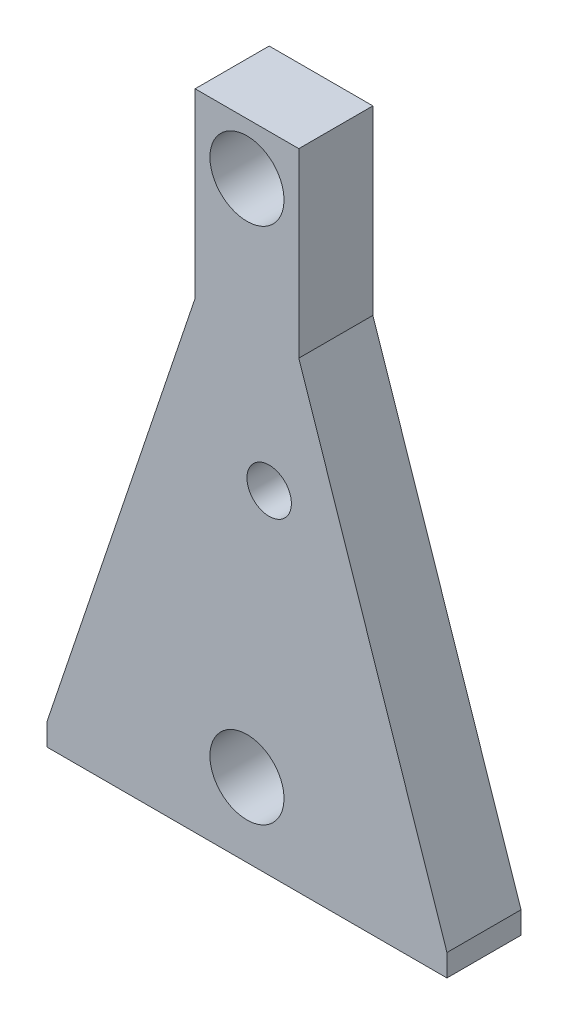
ISO-10303-21;
HEADER;
FILE_DESCRIPTION(('STEP AP214'),'2;1');
FILE_NAME('part.step','',(''),(''),'','','');
FILE_SCHEMA(('AUTOMOTIVE_DESIGN { 1 0 10303 214 1 1 1 1 }'));
ENDSEC;
DATA;
#1=APPLICATION_CONTEXT('core data for automotive mechanical design processes');
#2=APPLICATION_PROTOCOL_DEFINITION('international standard','automotive_design',2000,#1);
#3=PRODUCT_CONTEXT('',#1,'mechanical');
#4=PRODUCT('Part','Part','',(#3));
#5=PRODUCT_RELATED_PRODUCT_CATEGORY('part','',(#4));
#6=PRODUCT_DEFINITION_FORMATION('','',#4);
#7=PRODUCT_DEFINITION_CONTEXT('part definition',#1,'design');
#8=PRODUCT_DEFINITION('design','',#6,#7);
#9=PRODUCT_DEFINITION_SHAPE('','',#8);
#10=(LENGTH_UNIT() NAMED_UNIT(*) SI_UNIT(.MILLI.,.METRE.));
#11=(NAMED_UNIT(*) PLANE_ANGLE_UNIT() SI_UNIT($,.RADIAN.));
#12=(NAMED_UNIT(*) SI_UNIT($,.STERADIAN.) SOLID_ANGLE_UNIT());
#13=UNCERTAINTY_MEASURE_WITH_UNIT(LENGTH_MEASURE(1.E-05),#10,'distance_accuracy_value','');
#14=(GEOMETRIC_REPRESENTATION_CONTEXT(3) GLOBAL_UNCERTAINTY_ASSIGNED_CONTEXT((#13)) GLOBAL_UNIT_ASSIGNED_CONTEXT((#10,
#11,#12)) REPRESENTATION_CONTEXT('',''));
#15=CARTESIAN_POINT('',(0.,0.,0.));
#16=DIRECTION('',(0.,0.,1.));
#17=DIRECTION('',(1.,0.,0.));
#18=AXIS2_PLACEMENT_3D('',#15,#16,#17);
#19=CARTESIAN_POINT('',(0.,0.,5.));
#20=DIRECTION('',(1.,0.,0.));
#21=DIRECTION('',(0.,0.,-1.));
#22=AXIS2_PLACEMENT_3D('',#19,#20,#21);
#23=PLANE('',#22);
#24=DIRECTION('',(0.,0.,-1.));
#25=VECTOR('',#24,1.);
#26=CARTESIAN_POINT('',(0.,29.75,5.));
#27=LINE('',#26,#25);
#28=CARTESIAN_POINT('',(0.,29.75,5.));
#29=VERTEX_POINT('',#28);
#30=CARTESIAN_POINT('',(0.,29.75,0.));
#31=VERTEX_POINT('',#30);
#32=EDGE_CURVE('E50',#29,#31,#27,.T.);
#33=ORIENTED_EDGE('',*,*,#32,.F.);
#34=DIRECTION('',(0.,-1.,0.));
#35=VECTOR('',#34,1.);
#36=CARTESIAN_POINT('',(0.,0.,5.));
#37=LINE('',#36,#35);
#38=CARTESIAN_POINT('',(0.,42.,5.));
#39=VERTEX_POINT('',#38);
#40=EDGE_CURVE('E183',#39,#29,#37,.T.);
#41=ORIENTED_EDGE('',*,*,#40,.F.);
#42=DIRECTION('',(0.,0.,-1.));
#43=VECTOR('',#42,1.);
#44=CARTESIAN_POINT('',(0.,42.,5.));
#45=LINE('',#44,#43);
#46=CARTESIAN_POINT('',(0.,42.,0.));
#47=VERTEX_POINT('',#46);
#48=EDGE_CURVE('E43',#39,#47,#45,.T.);
#49=ORIENTED_EDGE('',*,*,#48,.T.);
#50=DIRECTION('',(0.,-1.,0.));
#51=VECTOR('',#50,1.);
#52=CARTESIAN_POINT('',(0.,0.,0.));
#53=LINE('',#52,#51);
#54=EDGE_CURVE('E174',#47,#31,#53,.T.);
#55=ORIENTED_EDGE('',*,*,#54,.T.);
#56=EDGE_LOOP('',(#33,#41,#49,#55));
#57=FACE_BOUND('',#56,.T.);
#58=ADVANCED_FACE('F36',(#57),#23,.F.);
#59=CARTESIAN_POINT('',(7.,0.,5.));
#60=DIRECTION('',(-1.,0.,0.));
#61=DIRECTION('',(0.,0.,1.));
#62=AXIS2_PLACEMENT_3D('',#59,#60,#61);
#63=PLANE('',#62);
#64=DIRECTION('',(0.,1.,0.));
#65=VECTOR('',#64,1.);
#66=CARTESIAN_POINT('',(7.,0.,5.));
#67=LINE('',#66,#65);
#68=CARTESIAN_POINT('',(7.,29.75,5.));
#69=VERTEX_POINT('',#68);
#70=CARTESIAN_POINT('',(7.,42.,5.));
#71=VERTEX_POINT('',#70);
#72=EDGE_CURVE('E185',#69,#71,#67,.T.);
#73=ORIENTED_EDGE('',*,*,#72,.F.);
#74=DIRECTION('',(0.,0.,-1.));
#75=VECTOR('',#74,1.);
#76=CARTESIAN_POINT('',(7.,29.75,5.));
#77=LINE('',#76,#75);
#78=CARTESIAN_POINT('',(7.,29.75,0.));
#79=VERTEX_POINT('',#78);
#80=EDGE_CURVE('E159',#69,#79,#77,.T.);
#81=ORIENTED_EDGE('',*,*,#80,.T.);
#82=DIRECTION('',(0.,1.,0.));
#83=VECTOR('',#82,1.);
#84=CARTESIAN_POINT('',(7.,0.,0.));
#85=LINE('',#84,#83);
#86=CARTESIAN_POINT('',(7.,42.,0.));
#87=VERTEX_POINT('',#86);
#88=EDGE_CURVE('E191',#79,#87,#85,.T.);
#89=ORIENTED_EDGE('',*,*,#88,.T.);
#90=DIRECTION('',(0.,0.,-1.));
#91=VECTOR('',#90,1.);
#92=CARTESIAN_POINT('',(7.,42.,5.));
#93=LINE('',#92,#91);
#94=EDGE_CURVE('E11',#71,#87,#93,.T.);
#95=ORIENTED_EDGE('',*,*,#94,.F.);
#96=EDGE_LOOP('',(#73,#81,#89,#95));
#97=FACE_BOUND('',#96,.T.);
#98=ADVANCED_FACE('F218',(#97),#63,.F.);
#99=CARTESIAN_POINT('',(0.,42.,5.));
#100=DIRECTION('',(0.,-1.,0.));
#101=DIRECTION('',(0.,0.,-1.));
#102=AXIS2_PLACEMENT_3D('',#99,#100,#101);
#103=PLANE('',#102);
#104=DIRECTION('',(-1.,0.,0.));
#105=VECTOR('',#104,1.);
#106=CARTESIAN_POINT('',(0.,42.,0.));
#107=LINE('',#106,#105);
#108=EDGE_CURVE('E186',#87,#47,#107,.T.);
#109=ORIENTED_EDGE('',*,*,#108,.T.);
#110=ORIENTED_EDGE('',*,*,#48,.F.);
#111=DIRECTION('',(-1.,0.,0.));
#112=VECTOR('',#111,1.);
#113=CARTESIAN_POINT('',(0.,42.,5.));
#114=LINE('',#113,#112);
#115=EDGE_CURVE('E188',#71,#39,#114,.T.);
#116=ORIENTED_EDGE('',*,*,#115,.F.);
#117=ORIENTED_EDGE('',*,*,#94,.T.);
#118=EDGE_LOOP('',(#109,#110,#116,#117));
#119=FACE_BOUND('',#118,.T.);
#120=ADVANCED_FACE('F216',(#119),#103,.F.);
#121=CARTESIAN_POINT('',(0.,0.,5.));
#122=DIRECTION('',(0.,0.,-1.));
#123=DIRECTION('',(-1.,0.,0.));
#124=AXIS2_PLACEMENT_3D('',#121,#122,#123);
#125=PLANE('',#124);
#126=CARTESIAN_POINT('',(5.,21.,5.));
#127=DIRECTION('',(0.,0.,-1.));
#128=DIRECTION('',(-1.,0.,0.));
#129=AXIS2_PLACEMENT_3D('',#126,#127,#128);
#130=CIRCLE('',#129,1.5);
#131=CARTESIAN_POINT('',(3.5,21.,5.));
#132=VERTEX_POINT('',#131);
#133=EDGE_CURVE('E167',#132,#132,#130,.T.);
#134=ORIENTED_EDGE('',*,*,#133,.T.);
#135=EDGE_LOOP('',(#134));
#136=FACE_BOUND('',#135,.T.);
#137=CARTESIAN_POINT('',(3.50000000000001,38.5,5.));
#138=DIRECTION('',(0.,0.,-1.));
#139=DIRECTION('',(-1.,0.,0.));
#140=AXIS2_PLACEMENT_3D('',#137,#138,#139);
#141=CIRCLE('',#140,2.5);
#142=CARTESIAN_POINT('',(1.00000000000001,38.5,5.));
#143=VERTEX_POINT('',#142);
#144=EDGE_CURVE('E171',#143,#143,#141,.T.);
#145=ORIENTED_EDGE('',*,*,#144,.T.);
#146=EDGE_LOOP('',(#145));
#147=FACE_BOUND('',#146,.T.);
#148=CARTESIAN_POINT('',(3.5,3.5,5.));
#149=DIRECTION('',(0.,0.,-1.));
#150=DIRECTION('',(-1.,0.,0.));
#151=AXIS2_PLACEMENT_3D('',#148,#149,#150);
#152=CIRCLE('',#151,2.5);
#153=CARTESIAN_POINT('',(1.,3.5,5.));
#154=VERTEX_POINT('',#153);
#155=EDGE_CURVE('E178',#154,#154,#152,.T.);
#156=ORIENTED_EDGE('',*,*,#155,.T.);
#157=EDGE_LOOP('',(#156));
#158=FACE_BOUND('',#157,.T.);
#159=ORIENTED_EDGE('',*,*,#40,.T.);
#160=DIRECTION('',(0.318616385711056,0.947883747490389,0.));
#161=VECTOR('',#160,1.);
#162=CARTESIAN_POINT('',(0.,29.75,5.));
#163=LINE('',#162,#161);
#164=CARTESIAN_POINT('',(-10.,0.,5.));
#165=VERTEX_POINT('',#164);
#166=EDGE_CURVE('E148',#165,#29,#163,.T.);
#167=ORIENTED_EDGE('',*,*,#166,.F.);
#168=DIRECTION('',(0.,1.,0.));
#169=VECTOR('',#168,1.);
#170=CARTESIAN_POINT('',(-10.,-1.49,5.));
#171=LINE('',#170,#169);
#172=CARTESIAN_POINT('',(-10.,-1.49,5.));
#173=VERTEX_POINT('',#172);
#174=EDGE_CURVE('E141',#173,#165,#171,.T.);
#175=ORIENTED_EDGE('',*,*,#174,.F.);
#176=DIRECTION('',(-1.,0.,0.));
#177=VECTOR('',#176,1.);
#178=CARTESIAN_POINT('',(17.,-1.49,5.));
#179=LINE('',#178,#177);
#180=CARTESIAN_POINT('',(17.,-1.49,5.));
#181=VERTEX_POINT('',#180);
#182=EDGE_CURVE('E129',#181,#173,#179,.T.);
#183=ORIENTED_EDGE('',*,*,#182,.F.);
#184=DIRECTION('',(0.,1.,0.));
#185=VECTOR('',#184,1.);
#186=CARTESIAN_POINT('',(17.,-1.49,5.));
#187=LINE('',#186,#185);
#188=CARTESIAN_POINT('',(17.,0.,5.));
#189=VERTEX_POINT('',#188);
#190=EDGE_CURVE('E144',#181,#189,#187,.T.);
#191=ORIENTED_EDGE('',*,*,#190,.T.);
#192=DIRECTION('',(0.318616385711055,-0.947883747490389,0.));
#193=VECTOR('',#192,1.);
#194=CARTESIAN_POINT('',(7.,29.75,5.));
#195=LINE('',#194,#193);
#196=EDGE_CURVE('E157',#69,#189,#195,.T.);
#197=ORIENTED_EDGE('',*,*,#196,.F.);
#198=ORIENTED_EDGE('',*,*,#72,.T.);
#199=ORIENTED_EDGE('',*,*,#115,.T.);
#200=EDGE_LOOP('',(#159,#167,#175,#183,#191,#197,#198,#199));
#201=FACE_BOUND('',#200,.T.);
#202=ADVANCED_FACE('F212',(#136,#147,#158,#201),#125,.F.);
#203=CARTESIAN_POINT('',(0.,0.,0.));
#204=DIRECTION('',(0.,0.,-1.));
#205=DIRECTION('',(-1.,0.,0.));
#206=AXIS2_PLACEMENT_3D('',#203,#204,#205);
#207=PLANE('',#206);
#208=CARTESIAN_POINT('',(5.,21.,0.));
#209=DIRECTION('',(0.,0.,-1.));
#210=DIRECTION('',(-1.,0.,0.));
#211=AXIS2_PLACEMENT_3D('',#208,#209,#210);
#212=CIRCLE('',#211,1.5);
#213=CARTESIAN_POINT('',(3.5,21.,0.));
#214=VERTEX_POINT('',#213);
#215=EDGE_CURVE('E163',#214,#214,#212,.T.);
#216=ORIENTED_EDGE('',*,*,#215,.F.);
#217=EDGE_LOOP('',(#216));
#218=FACE_BOUND('',#217,.T.);
#219=CARTESIAN_POINT('',(3.50000000000001,38.5,0.));
#220=DIRECTION('',(0.,0.,-1.));
#221=DIRECTION('',(-1.,0.,0.));
#222=AXIS2_PLACEMENT_3D('',#219,#220,#221);
#223=CIRCLE('',#222,2.5);
#224=CARTESIAN_POINT('',(1.00000000000001,38.5,0.));
#225=VERTEX_POINT('',#224);
#226=EDGE_CURVE('E175',#225,#225,#223,.T.);
#227=ORIENTED_EDGE('',*,*,#226,.F.);
#228=EDGE_LOOP('',(#227));
#229=FACE_BOUND('',#228,.T.);
#230=CARTESIAN_POINT('',(3.5,3.5,0.));
#231=DIRECTION('',(0.,0.,-1.));
#232=DIRECTION('',(-1.,0.,0.));
#233=AXIS2_PLACEMENT_3D('',#230,#231,#232);
#234=CIRCLE('',#233,2.5);
#235=CARTESIAN_POINT('',(1.,3.5,0.));
#236=VERTEX_POINT('',#235);
#237=EDGE_CURVE('E170',#236,#236,#234,.T.);
#238=ORIENTED_EDGE('',*,*,#237,.F.);
#239=EDGE_LOOP('',(#238));
#240=FACE_BOUND('',#239,.T.);
#241=ORIENTED_EDGE('',*,*,#54,.F.);
#242=ORIENTED_EDGE('',*,*,#108,.F.);
#243=ORIENTED_EDGE('',*,*,#88,.F.);
#244=DIRECTION('',(0.318616385711055,-0.947883747490389,0.));
#245=VECTOR('',#244,1.);
#246=CARTESIAN_POINT('',(7.,29.75,0.));
#247=LINE('',#246,#245);
#248=CARTESIAN_POINT('',(17.,0.,0.));
#249=VERTEX_POINT('',#248);
#250=EDGE_CURVE('E58',#79,#249,#247,.T.);
#251=ORIENTED_EDGE('',*,*,#250,.T.);
#252=DIRECTION('',(0.,1.,0.));
#253=VECTOR('',#252,1.);
#254=CARTESIAN_POINT('',(17.,-1.49,0.));
#255=LINE('',#254,#253);
#256=CARTESIAN_POINT('',(17.,-1.49,0.));
#257=VERTEX_POINT('',#256);
#258=EDGE_CURVE('E135',#257,#249,#255,.T.);
#259=ORIENTED_EDGE('',*,*,#258,.F.);
#260=DIRECTION('',(1.,0.,0.));
#261=VECTOR('',#260,1.);
#262=CARTESIAN_POINT('',(17.,-1.49,0.));
#263=LINE('',#262,#261);
#264=CARTESIAN_POINT('',(-10.,-1.49,0.));
#265=VERTEX_POINT('',#264);
#266=EDGE_CURVE('E133',#265,#257,#263,.T.);
#267=ORIENTED_EDGE('',*,*,#266,.F.);
#268=DIRECTION('',(0.,1.,0.));
#269=VECTOR('',#268,1.);
#270=CARTESIAN_POINT('',(-10.,-1.49,0.));
#271=LINE('',#270,#269);
#272=CARTESIAN_POINT('',(-10.,0.,0.));
#273=VERTEX_POINT('',#272);
#274=EDGE_CURVE('E138',#265,#273,#271,.T.);
#275=ORIENTED_EDGE('',*,*,#274,.T.);
#276=DIRECTION('',(0.318616385711056,0.947883747490389,0.));
#277=VECTOR('',#276,1.);
#278=CARTESIAN_POINT('',(0.,29.75,0.));
#279=LINE('',#278,#277);
#280=EDGE_CURVE('E147',#273,#31,#279,.T.);
#281=ORIENTED_EDGE('',*,*,#280,.T.);
#282=EDGE_LOOP('',(#241,#242,#243,#251,#259,#267,#275,#281));
#283=FACE_BOUND('',#282,.T.);
#284=ADVANCED_FACE('F200',(#218,#229,#240,#283),#207,.T.);
#285=CARTESIAN_POINT('',(3.5,3.5,5.));
#286=DIRECTION('',(0.,0.,-1.));
#287=DIRECTION('',(-1.,0.,0.));
#288=AXIS2_PLACEMENT_3D('',#285,#286,#287);
#289=CYLINDRICAL_SURFACE('',#288,2.5);
#290=ORIENTED_EDGE('',*,*,#155,.F.);
#291=EDGE_LOOP('',(#290));
#292=FACE_BOUND('',#291,.T.);
#293=ORIENTED_EDGE('',*,*,#237,.T.);
#294=EDGE_LOOP('',(#293));
#295=FACE_BOUND('',#294,.T.);
#296=ADVANCED_FACE('F251',(#292,#295),#289,.F.);
#297=CARTESIAN_POINT('',(3.50000000000001,38.5,5.));
#298=DIRECTION('',(0.,0.,-1.));
#299=DIRECTION('',(-1.,0.,0.));
#300=AXIS2_PLACEMENT_3D('',#297,#298,#299);
#301=CYLINDRICAL_SURFACE('',#300,2.5);
#302=ORIENTED_EDGE('',*,*,#144,.F.);
#303=EDGE_LOOP('',(#302));
#304=FACE_BOUND('',#303,.T.);
#305=ORIENTED_EDGE('',*,*,#226,.T.);
#306=EDGE_LOOP('',(#305));
#307=FACE_BOUND('',#306,.T.);
#308=ADVANCED_FACE('F258',(#304,#307),#301,.F.);
#309=CARTESIAN_POINT('',(5.,21.,10.));
#310=DIRECTION('',(0.,0.,-1.));
#311=DIRECTION('',(-1.,0.,0.));
#312=AXIS2_PLACEMENT_3D('',#309,#310,#311);
#313=CYLINDRICAL_SURFACE('',#312,1.5);
#314=ORIENTED_EDGE('',*,*,#215,.T.);
#315=EDGE_LOOP('',(#314));
#316=FACE_BOUND('',#315,.T.);
#317=ORIENTED_EDGE('',*,*,#133,.F.);
#318=EDGE_LOOP('',(#317));
#319=FACE_BOUND('',#318,.T.);
#320=ADVANCED_FACE('F262',(#316,#319),#313,.F.);
#321=CARTESIAN_POINT('',(7.,29.75,5.));
#322=DIRECTION('',(0.947883747490389,0.318616385711055,0.));
#323=DIRECTION('',(-0.318616385711055,0.947883747490389,0.));
#324=AXIS2_PLACEMENT_3D('',#321,#322,#323);
#325=PLANE('',#324);
#326=ORIENTED_EDGE('',*,*,#250,.F.);
#327=ORIENTED_EDGE('',*,*,#80,.F.);
#328=ORIENTED_EDGE('',*,*,#196,.T.);
#329=DIRECTION('',(0.,0.,-1.));
#330=VECTOR('',#329,1.);
#331=CARTESIAN_POINT('',(17.,0.,5.));
#332=LINE('',#331,#330);
#333=EDGE_CURVE('E161',#189,#249,#332,.T.);
#334=ORIENTED_EDGE('',*,*,#333,.T.);
#335=EDGE_LOOP('',(#326,#327,#328,#334));
#336=FACE_BOUND('',#335,.T.);
#337=ADVANCED_FACE('F266',(#336),#325,.T.);
#338=CARTESIAN_POINT('',(0.,29.75,5.));
#339=DIRECTION('',(-0.947883747490389,0.318616385711056,0.));
#340=DIRECTION('',(-0.318616385711056,-0.947883747490389,0.));
#341=AXIS2_PLACEMENT_3D('',#338,#339,#340);
#342=PLANE('',#341);
#343=ORIENTED_EDGE('',*,*,#280,.F.);
#344=DIRECTION('',(0.,0.,-1.));
#345=VECTOR('',#344,1.);
#346=CARTESIAN_POINT('',(-10.,0.,5.));
#347=LINE('',#346,#345);
#348=EDGE_CURVE('E153',#165,#273,#347,.T.);
#349=ORIENTED_EDGE('',*,*,#348,.F.);
#350=ORIENTED_EDGE('',*,*,#166,.T.);
#351=ORIENTED_EDGE('',*,*,#32,.T.);
#352=EDGE_LOOP('',(#343,#349,#350,#351));
#353=FACE_BOUND('',#352,.T.);
#354=ADVANCED_FACE('F205',(#353),#342,.T.);
#355=CARTESIAN_POINT('',(17.,-1.49,5.));
#356=DIRECTION('',(-1.,0.,0.));
#357=DIRECTION('',(0.,0.,1.));
#358=AXIS2_PLACEMENT_3D('',#355,#356,#357);
#359=PLANE('',#358);
#360=ORIENTED_EDGE('',*,*,#333,.F.);
#361=ORIENTED_EDGE('',*,*,#190,.F.);
#362=DIRECTION('',(0.,0.,1.));
#363=VECTOR('',#362,1.);
#364=CARTESIAN_POINT('',(17.,-1.49,5.));
#365=LINE('',#364,#363);
#366=EDGE_CURVE('E126',#257,#181,#365,.T.);
#367=ORIENTED_EDGE('',*,*,#366,.F.);
#368=ORIENTED_EDGE('',*,*,#258,.T.);
#369=EDGE_LOOP('',(#360,#361,#367,#368));
#370=FACE_BOUND('',#369,.T.);
#371=ADVANCED_FACE('F223',(#370),#359,.F.);
#372=CARTESIAN_POINT('',(-10.,-1.49,5.));
#373=DIRECTION('',(1.,0.,0.));
#374=DIRECTION('',(0.,0.,-1.));
#375=AXIS2_PLACEMENT_3D('',#372,#373,#374);
#376=PLANE('',#375);
#377=ORIENTED_EDGE('',*,*,#348,.T.);
#378=ORIENTED_EDGE('',*,*,#274,.F.);
#379=DIRECTION('',(0.,0.,-1.));
#380=VECTOR('',#379,1.);
#381=CARTESIAN_POINT('',(-10.,-1.49,5.));
#382=LINE('',#381,#380);
#383=EDGE_CURVE('E131',#173,#265,#382,.T.);
#384=ORIENTED_EDGE('',*,*,#383,.F.);
#385=ORIENTED_EDGE('',*,*,#174,.T.);
#386=EDGE_LOOP('',(#377,#378,#384,#385));
#387=FACE_BOUND('',#386,.T.);
#388=ADVANCED_FACE('F208',(#387),#376,.F.);
#389=CARTESIAN_POINT('',(0.,-1.49,0.));
#390=DIRECTION('',(0.,1.,0.));
#391=DIRECTION('',(0.,0.,1.));
#392=AXIS2_PLACEMENT_3D('',#389,#390,#391);
#393=PLANE('',#392);
#394=CARTESIAN_POINT('',(-4.00000000000001,-1.49,2.5));
#395=DIRECTION('',(0.,-1.,0.));
#396=DIRECTION('',(0.,0.,-1.));
#397=AXIS2_PLACEMENT_3D('',#394,#395,#396);
#398=CIRCLE('',#397,1.24999999999999);
#399=CARTESIAN_POINT('',(-4.00000000000001,-1.49,1.25000000000002));
#400=VERTEX_POINT('',#399);
#401=EDGE_CURVE('E116',#400,#400,#398,.T.);
#402=ORIENTED_EDGE('',*,*,#401,.F.);
#403=EDGE_LOOP('',(#402));
#404=FACE_BOUND('',#403,.T.);
#405=CARTESIAN_POINT('',(11.,-1.49,2.50000000000001));
#406=DIRECTION('',(0.,-1.,0.));
#407=DIRECTION('',(0.,0.,-1.));
#408=AXIS2_PLACEMENT_3D('',#405,#406,#407);
#409=CIRCLE('',#408,1.24999999999999);
#410=CARTESIAN_POINT('',(11.,-1.49,1.25000000000002));
#411=VERTEX_POINT('',#410);
#412=EDGE_CURVE('E115',#411,#411,#409,.T.);
#413=ORIENTED_EDGE('',*,*,#412,.F.);
#414=EDGE_LOOP('',(#413));
#415=FACE_BOUND('',#414,.T.);
#416=ORIENTED_EDGE('',*,*,#366,.T.);
#417=ORIENTED_EDGE('',*,*,#182,.T.);
#418=ORIENTED_EDGE('',*,*,#383,.T.);
#419=ORIENTED_EDGE('',*,*,#266,.T.);
#420=EDGE_LOOP('',(#416,#417,#418,#419));
#421=FACE_BOUND('',#420,.T.);
#422=ADVANCED_FACE('F226',(#404,#415,#421),#393,.F.);
#423=CARTESIAN_POINT('',(11.,7.00999999999999,2.50000000000001));
#424=DIRECTION('',(0.,-1.,0.));
#425=DIRECTION('',(0.,0.,-1.));
#426=AXIS2_PLACEMENT_3D('',#423,#424,#425);
#427=CONICAL_SURFACE('',#426,1.24999999999999,1.02974425867665);
#428=CARTESIAN_POINT('',(11.,7.76107577378444,2.50000000000001));
#429=VERTEX_POINT('',#428);
#430=VERTEX_LOOP('',#429);
#431=FACE_BOUND('',#430,.T.);
#432=CARTESIAN_POINT('',(11.,7.00999999999999,2.50000000000001));
#433=DIRECTION('',(0.,-1.,0.));
#434=DIRECTION('',(0.,0.,-1.));
#435=AXIS2_PLACEMENT_3D('',#432,#433,#434);
#436=CIRCLE('',#435,1.24999999999999);
#437=CARTESIAN_POINT('',(11.,7.00999999999999,1.25000000000002));
#438=VERTEX_POINT('',#437);
#439=EDGE_CURVE('E119',#438,#438,#436,.T.);
#440=ORIENTED_EDGE('',*,*,#439,.T.);
#441=EDGE_LOOP('',(#440));
#442=FACE_BOUND('',#441,.T.);
#443=ADVANCED_FACE('F228',(#431,#442),#427,.F.);
#444=CARTESIAN_POINT('',(11.,-1.49,2.50000000000001));
#445=DIRECTION('',(0.,-1.,0.));
#446=DIRECTION('',(0.,0.,-1.));
#447=AXIS2_PLACEMENT_3D('',#444,#445,#446);
#448=CYLINDRICAL_SURFACE('',#447,1.24999999999999);
#449=ORIENTED_EDGE('',*,*,#439,.F.);
#450=EDGE_LOOP('',(#449));
#451=FACE_BOUND('',#450,.T.);
#452=ORIENTED_EDGE('',*,*,#412,.T.);
#453=EDGE_LOOP('',(#452));
#454=FACE_BOUND('',#453,.T.);
#455=ADVANCED_FACE('F109',(#451,#454),#448,.F.);
#456=CARTESIAN_POINT('',(-4.00000000000001,7.00999999999999,2.5));
#457=DIRECTION('',(0.,-1.,0.));
#458=DIRECTION('',(0.,0.,-1.));
#459=AXIS2_PLACEMENT_3D('',#456,#457,#458);
#460=CONICAL_SURFACE('',#459,1.24999999999999,1.02974425867665);
#461=CARTESIAN_POINT('',(-4.00000000000002,7.76107577378444,2.5));
#462=VERTEX_POINT('',#461);
#463=VERTEX_LOOP('',#462);
#464=FACE_BOUND('',#463,.T.);
#465=CARTESIAN_POINT('',(-4.00000000000001,7.00999999999999,2.5));
#466=DIRECTION('',(0.,-1.,0.));
#467=DIRECTION('',(0.,0.,-1.));
#468=AXIS2_PLACEMENT_3D('',#465,#466,#467);
#469=CIRCLE('',#468,1.24999999999999);
#470=CARTESIAN_POINT('',(-4.00000000000001,7.00999999999999,1.25000000000002));
#471=VERTEX_POINT('',#470);
#472=EDGE_CURVE('E113',#471,#471,#469,.T.);
#473=ORIENTED_EDGE('',*,*,#472,.T.);
#474=EDGE_LOOP('',(#473));
#475=FACE_BOUND('',#474,.T.);
#476=ADVANCED_FACE('F105',(#464,#475),#460,.F.);
#477=CARTESIAN_POINT('',(-4.00000000000001,-1.49,2.5));
#478=DIRECTION('',(0.,-1.,0.));
#479=DIRECTION('',(0.,0.,-1.));
#480=AXIS2_PLACEMENT_3D('',#477,#478,#479);
#481=CYLINDRICAL_SURFACE('',#480,1.24999999999999);
#482=ORIENTED_EDGE('',*,*,#472,.F.);
#483=EDGE_LOOP('',(#482));
#484=FACE_BOUND('',#483,.T.);
#485=ORIENTED_EDGE('',*,*,#401,.T.);
#486=EDGE_LOOP('',(#485));
#487=FACE_BOUND('',#486,.T.);
#488=ADVANCED_FACE('F108',(#484,#487),#481,.F.);
#489=CLOSED_SHELL('',(#58,#98,#120,#202,#284,#296,#308,#320,#337,#354,#371,#388,#422,#443,#455,
#476,#488));
#490=MANIFOLD_SOLID_BREP('B2',#489);
#491=ADVANCED_BREP_SHAPE_REPRESENTATION('',(#18,#490),#14);
#492=SHAPE_DEFINITION_REPRESENTATION(#9,#491);
ENDSEC;
END-ISO-10303-21;
